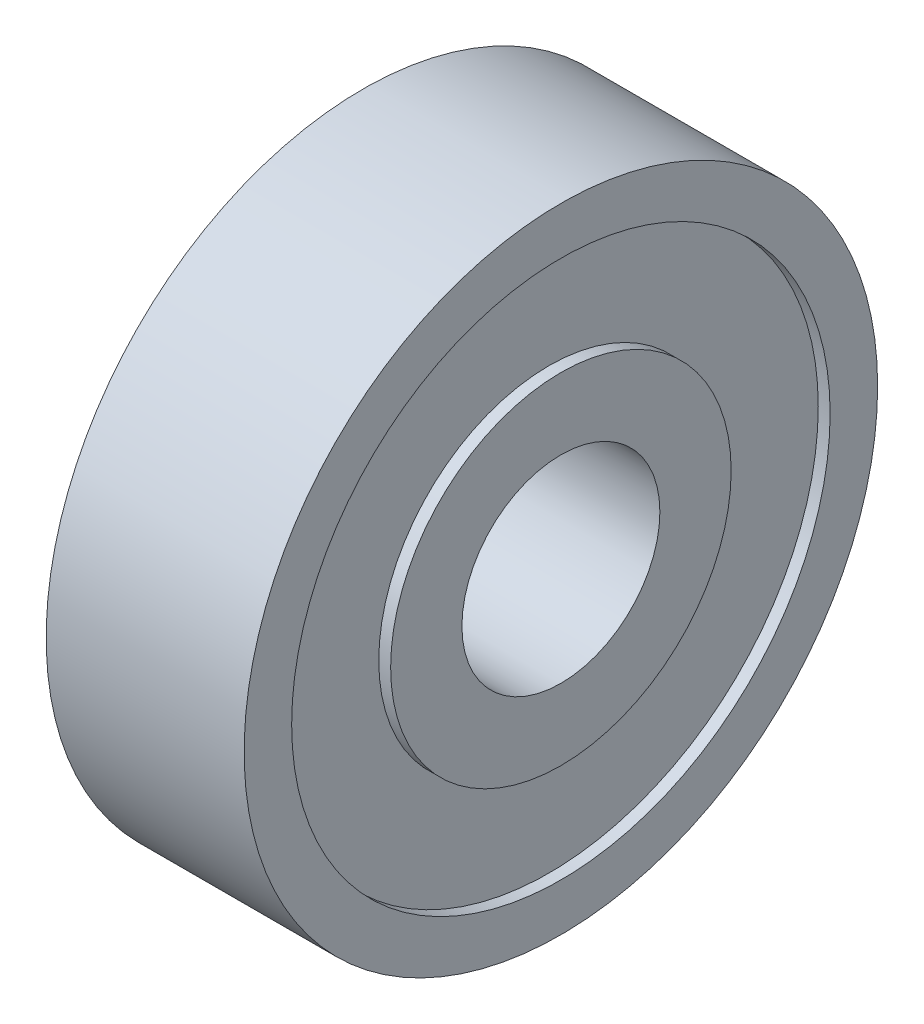
ISO-10303-21;
HEADER;
FILE_DESCRIPTION(('STEP AP214'),'2;1');
FILE_NAME('part.step','',(''),(''),'','','');
FILE_SCHEMA(('AUTOMOTIVE_DESIGN { 1 0 10303 214 1 1 1 1 }'));
ENDSEC;
DATA;
#1=APPLICATION_CONTEXT('core data for automotive mechanical design processes');
#2=APPLICATION_PROTOCOL_DEFINITION('international standard','automotive_design',2000,#1);
#3=PRODUCT_CONTEXT('',#1,'mechanical');
#4=PRODUCT('Part','Part','',(#3));
#5=PRODUCT_RELATED_PRODUCT_CATEGORY('part','',(#4));
#6=PRODUCT_DEFINITION_FORMATION('','',#4);
#7=PRODUCT_DEFINITION_CONTEXT('part definition',#1,'design');
#8=PRODUCT_DEFINITION('design','',#6,#7);
#9=PRODUCT_DEFINITION_SHAPE('','',#8);
#10=(LENGTH_UNIT() NAMED_UNIT(*) SI_UNIT(.MILLI.,.METRE.));
#11=(NAMED_UNIT(*) PLANE_ANGLE_UNIT() SI_UNIT($,.RADIAN.));
#12=(NAMED_UNIT(*) SI_UNIT($,.STERADIAN.) SOLID_ANGLE_UNIT());
#13=UNCERTAINTY_MEASURE_WITH_UNIT(LENGTH_MEASURE(1.E-05),#10,'distance_accuracy_value','');
#14=(GEOMETRIC_REPRESENTATION_CONTEXT(3) GLOBAL_UNCERTAINTY_ASSIGNED_CONTEXT((#13)) GLOBAL_UNIT_ASSIGNED_CONTEXT((#10,
#11,#12)) REPRESENTATION_CONTEXT('',''));
#15=CARTESIAN_POINT('',(0.,0.,0.));
#16=DIRECTION('',(0.,0.,1.));
#17=DIRECTION('',(1.,0.,0.));
#18=AXIS2_PLACEMENT_3D('',#15,#16,#17);
#19=CARTESIAN_POINT('',(-2.5,2.5,0.));
#20=DIRECTION('',(-1.,0.,0.));
#21=DIRECTION('',(0.,0.,1.));
#22=AXIS2_PLACEMENT_3D('',#19,#20,#21);
#23=PLANE('',#22);
#24=CARTESIAN_POINT('',(-2.5,0.,0.));
#25=DIRECTION('',(1.,0.,0.));
#26=DIRECTION('',(0.,0.,-1.));
#27=AXIS2_PLACEMENT_3D('',#24,#25,#26);
#28=CIRCLE('',#27,2.5);
#29=CARTESIAN_POINT('',(-2.5,0.,-2.5));
#30=VERTEX_POINT('',#29);
#31=EDGE_CURVE('E99',#30,#30,#28,.T.);
#32=ORIENTED_EDGE('',*,*,#31,.T.);
#33=EDGE_LOOP('',(#32));
#34=FACE_BOUND('',#33,.T.);
#35=CARTESIAN_POINT('',(-2.5,0.,0.));
#36=DIRECTION('',(1.,0.,0.));
#37=DIRECTION('',(0.,0.,-1.));
#38=AXIS2_PLACEMENT_3D('',#35,#36,#37);
#39=CIRCLE('',#38,4.3);
#40=CARTESIAN_POINT('',(-2.5,0.,-4.3));
#41=VERTEX_POINT('',#40);
#42=EDGE_CURVE('E10',#41,#41,#39,.T.);
#43=ORIENTED_EDGE('',*,*,#42,.F.);
#44=EDGE_LOOP('',(#43));
#45=FACE_BOUND('',#44,.T.);
#46=ADVANCED_FACE('F47',(#34,#45),#23,.T.);
#47=CARTESIAN_POINT('',(0.,0.,0.));
#48=DIRECTION('',(1.,0.,0.));
#49=DIRECTION('',(0.,0.,-1.));
#50=AXIS2_PLACEMENT_3D('',#47,#48,#49);
#51=CYLINDRICAL_SURFACE('',#50,4.3);
#52=ORIENTED_EDGE('',*,*,#42,.T.);
#53=EDGE_LOOP('',(#52));
#54=FACE_BOUND('',#53,.T.);
#55=CARTESIAN_POINT('',(-2.2,0.,0.));
#56=DIRECTION('',(1.,0.,0.));
#57=DIRECTION('',(0.,0.,-1.));
#58=AXIS2_PLACEMENT_3D('',#55,#56,#57);
#59=CIRCLE('',#58,4.3);
#60=CARTESIAN_POINT('',(-2.2,0.,-4.3));
#61=VERTEX_POINT('',#60);
#62=EDGE_CURVE('E54',#61,#61,#59,.T.);
#63=ORIENTED_EDGE('',*,*,#62,.F.);
#64=EDGE_LOOP('',(#63));
#65=FACE_BOUND('',#64,.T.);
#66=ADVANCED_FACE('F117',(#54,#65),#51,.T.);
#67=CARTESIAN_POINT('',(-2.2,4.3,0.));
#68=DIRECTION('',(-1.,0.,0.));
#69=DIRECTION('',(0.,0.,1.));
#70=AXIS2_PLACEMENT_3D('',#67,#68,#69);
#71=PLANE('',#70);
#72=ORIENTED_EDGE('',*,*,#62,.T.);
#73=EDGE_LOOP('',(#72));
#74=FACE_BOUND('',#73,.T.);
#75=CARTESIAN_POINT('',(-2.2,0.,0.));
#76=DIRECTION('',(1.,0.,0.));
#77=DIRECTION('',(0.,0.,-1.));
#78=AXIS2_PLACEMENT_3D('',#75,#76,#77);
#79=CIRCLE('',#78,6.8);
#80=CARTESIAN_POINT('',(-2.2,0.,-6.8));
#81=VERTEX_POINT('',#80);
#82=EDGE_CURVE('E60',#81,#81,#79,.T.);
#83=ORIENTED_EDGE('',*,*,#82,.F.);
#84=EDGE_LOOP('',(#83));
#85=FACE_BOUND('',#84,.T.);
#86=ADVANCED_FACE('F121',(#74,#85),#71,.T.);
#87=CARTESIAN_POINT('',(0.,0.,0.));
#88=DIRECTION('',(1.,0.,0.));
#89=DIRECTION('',(0.,0.,-1.));
#90=AXIS2_PLACEMENT_3D('',#87,#88,#89);
#91=CYLINDRICAL_SURFACE('',#90,6.8);
#92=ORIENTED_EDGE('',*,*,#82,.T.);
#93=EDGE_LOOP('',(#92));
#94=FACE_BOUND('',#93,.T.);
#95=CARTESIAN_POINT('',(-2.5,0.,0.));
#96=DIRECTION('',(1.,0.,0.));
#97=DIRECTION('',(0.,0.,-1.));
#98=AXIS2_PLACEMENT_3D('',#95,#96,#97);
#99=CIRCLE('',#98,6.8);
#100=CARTESIAN_POINT('',(-2.5,0.,-6.8));
#101=VERTEX_POINT('',#100);
#102=EDGE_CURVE('E66',#101,#101,#99,.T.);
#103=ORIENTED_EDGE('',*,*,#102,.F.);
#104=EDGE_LOOP('',(#103));
#105=FACE_BOUND('',#104,.T.);
#106=ADVANCED_FACE('F126',(#94,#105),#91,.F.);
#107=CARTESIAN_POINT('',(-2.5,6.8,0.));
#108=DIRECTION('',(-1.,0.,0.));
#109=DIRECTION('',(0.,0.,1.));
#110=AXIS2_PLACEMENT_3D('',#107,#108,#109);
#111=PLANE('',#110);
#112=ORIENTED_EDGE('',*,*,#102,.T.);
#113=EDGE_LOOP('',(#112));
#114=FACE_BOUND('',#113,.T.);
#115=CARTESIAN_POINT('',(-2.5,0.,0.));
#116=DIRECTION('',(1.,0.,0.));
#117=DIRECTION('',(0.,0.,-1.));
#118=AXIS2_PLACEMENT_3D('',#115,#116,#117);
#119=CIRCLE('',#118,8.);
#120=CARTESIAN_POINT('',(-2.5,0.,-8.));
#121=VERTEX_POINT('',#120);
#122=EDGE_CURVE('E71',#121,#121,#119,.T.);
#123=ORIENTED_EDGE('',*,*,#122,.F.);
#124=EDGE_LOOP('',(#123));
#125=FACE_BOUND('',#124,.T.);
#126=ADVANCED_FACE('F132',(#114,#125),#111,.T.);
#127=CARTESIAN_POINT('',(0.,0.,0.));
#128=DIRECTION('',(1.,0.,0.));
#129=DIRECTION('',(0.,0.,-1.));
#130=AXIS2_PLACEMENT_3D('',#127,#128,#129);
#131=CYLINDRICAL_SURFACE('',#130,8.);
#132=ORIENTED_EDGE('',*,*,#122,.T.);
#133=EDGE_LOOP('',(#132));
#134=FACE_BOUND('',#133,.T.);
#135=CARTESIAN_POINT('',(2.5,0.,0.));
#136=DIRECTION('',(1.,0.,0.));
#137=DIRECTION('',(0.,0.,-1.));
#138=AXIS2_PLACEMENT_3D('',#135,#136,#137);
#139=CIRCLE('',#138,8.);
#140=CARTESIAN_POINT('',(2.5,0.,-8.));
#141=VERTEX_POINT('',#140);
#142=EDGE_CURVE('E75',#141,#141,#139,.T.);
#143=ORIENTED_EDGE('',*,*,#142,.F.);
#144=EDGE_LOOP('',(#143));
#145=FACE_BOUND('',#144,.T.);
#146=ADVANCED_FACE('F135',(#134,#145),#131,.T.);
#147=CARTESIAN_POINT('',(2.5,6.8,0.));
#148=DIRECTION('',(1.,0.,0.));
#149=DIRECTION('',(0.,0.,-1.));
#150=AXIS2_PLACEMENT_3D('',#147,#148,#149);
#151=PLANE('',#150);
#152=ORIENTED_EDGE('',*,*,#142,.T.);
#153=EDGE_LOOP('',(#152));
#154=FACE_BOUND('',#153,.T.);
#155=CARTESIAN_POINT('',(2.5,0.,0.));
#156=DIRECTION('',(1.,0.,0.));
#157=DIRECTION('',(0.,0.,-1.));
#158=AXIS2_PLACEMENT_3D('',#155,#156,#157);
#159=CIRCLE('',#158,6.8);
#160=CARTESIAN_POINT('',(2.5,0.,-6.8));
#161=VERTEX_POINT('',#160);
#162=EDGE_CURVE('E79',#161,#161,#159,.T.);
#163=ORIENTED_EDGE('',*,*,#162,.F.);
#164=EDGE_LOOP('',(#163));
#165=FACE_BOUND('',#164,.T.);
#166=ADVANCED_FACE('F139',(#154,#165),#151,.T.);
#167=CARTESIAN_POINT('',(0.,0.,0.));
#168=DIRECTION('',(1.,0.,0.));
#169=DIRECTION('',(0.,0.,-1.));
#170=AXIS2_PLACEMENT_3D('',#167,#168,#169);
#171=CYLINDRICAL_SURFACE('',#170,6.8);
#172=ORIENTED_EDGE('',*,*,#162,.T.);
#173=EDGE_LOOP('',(#172));
#174=FACE_BOUND('',#173,.T.);
#175=CARTESIAN_POINT('',(2.2,0.,0.));
#176=DIRECTION('',(1.,0.,0.));
#177=DIRECTION('',(0.,0.,-1.));
#178=AXIS2_PLACEMENT_3D('',#175,#176,#177);
#179=CIRCLE('',#178,6.8);
#180=CARTESIAN_POINT('',(2.2,0.,-6.8));
#181=VERTEX_POINT('',#180);
#182=EDGE_CURVE('E83',#181,#181,#179,.T.);
#183=ORIENTED_EDGE('',*,*,#182,.F.);
#184=EDGE_LOOP('',(#183));
#185=FACE_BOUND('',#184,.T.);
#186=ADVANCED_FACE('F143',(#174,#185),#171,.F.);
#187=CARTESIAN_POINT('',(2.2,4.3,0.));
#188=DIRECTION('',(1.,0.,0.));
#189=DIRECTION('',(0.,0.,-1.));
#190=AXIS2_PLACEMENT_3D('',#187,#188,#189);
#191=PLANE('',#190);
#192=ORIENTED_EDGE('',*,*,#182,.T.);
#193=EDGE_LOOP('',(#192));
#194=FACE_BOUND('',#193,.T.);
#195=CARTESIAN_POINT('',(2.2,0.,0.));
#196=DIRECTION('',(1.,0.,0.));
#197=DIRECTION('',(0.,0.,-1.));
#198=AXIS2_PLACEMENT_3D('',#195,#196,#197);
#199=CIRCLE('',#198,4.3);
#200=CARTESIAN_POINT('',(2.2,0.,-4.3));
#201=VERTEX_POINT('',#200);
#202=EDGE_CURVE('E87',#201,#201,#199,.T.);
#203=ORIENTED_EDGE('',*,*,#202,.F.);
#204=EDGE_LOOP('',(#203));
#205=FACE_BOUND('',#204,.T.);
#206=ADVANCED_FACE('F146',(#194,#205),#191,.T.);
#207=CARTESIAN_POINT('',(0.,0.,0.));
#208=DIRECTION('',(1.,0.,0.));
#209=DIRECTION('',(0.,0.,-1.));
#210=AXIS2_PLACEMENT_3D('',#207,#208,#209);
#211=CYLINDRICAL_SURFACE('',#210,4.3);
#212=ORIENTED_EDGE('',*,*,#202,.T.);
#213=EDGE_LOOP('',(#212));
#214=FACE_BOUND('',#213,.T.);
#215=CARTESIAN_POINT('',(2.5,0.,0.));
#216=DIRECTION('',(1.,0.,0.));
#217=DIRECTION('',(0.,0.,-1.));
#218=AXIS2_PLACEMENT_3D('',#215,#216,#217);
#219=CIRCLE('',#218,4.3);
#220=CARTESIAN_POINT('',(2.5,0.,-4.3));
#221=VERTEX_POINT('',#220);
#222=EDGE_CURVE('E91',#221,#221,#219,.T.);
#223=ORIENTED_EDGE('',*,*,#222,.F.);
#224=EDGE_LOOP('',(#223));
#225=FACE_BOUND('',#224,.T.);
#226=ADVANCED_FACE('F114',(#214,#225),#211,.T.);
#227=CARTESIAN_POINT('',(2.5,2.5,0.));
#228=DIRECTION('',(1.,0.,0.));
#229=DIRECTION('',(0.,0.,-1.));
#230=AXIS2_PLACEMENT_3D('',#227,#228,#229);
#231=PLANE('',#230);
#232=ORIENTED_EDGE('',*,*,#222,.T.);
#233=EDGE_LOOP('',(#232));
#234=FACE_BOUND('',#233,.T.);
#235=CARTESIAN_POINT('',(2.5,0.,0.));
#236=DIRECTION('',(1.,0.,0.));
#237=DIRECTION('',(0.,0.,-1.));
#238=AXIS2_PLACEMENT_3D('',#235,#236,#237);
#239=CIRCLE('',#238,2.5);
#240=CARTESIAN_POINT('',(2.5,0.,-2.5));
#241=VERTEX_POINT('',#240);
#242=EDGE_CURVE('E95',#241,#241,#239,.T.);
#243=ORIENTED_EDGE('',*,*,#242,.F.);
#244=EDGE_LOOP('',(#243));
#245=FACE_BOUND('',#244,.T.);
#246=ADVANCED_FACE('F107',(#234,#245),#231,.T.);
#247=CARTESIAN_POINT('',(0.,0.,0.));
#248=DIRECTION('',(1.,0.,0.));
#249=DIRECTION('',(0.,0.,-1.));
#250=AXIS2_PLACEMENT_3D('',#247,#248,#249);
#251=CYLINDRICAL_SURFACE('',#250,2.5);
#252=ORIENTED_EDGE('',*,*,#242,.T.);
#253=EDGE_LOOP('',(#252));
#254=FACE_BOUND('',#253,.T.);
#255=ORIENTED_EDGE('',*,*,#31,.F.);
#256=EDGE_LOOP('',(#255));
#257=FACE_BOUND('',#256,.T.);
#258=ADVANCED_FACE('F105',(#254,#257),#251,.F.);
#259=CLOSED_SHELL('',(#46,#66,#86,#106,#126,#146,#166,#186,#206,#226,#246,#258));
#260=MANIFOLD_SOLID_BREP('B2',#259);
#261=ADVANCED_BREP_SHAPE_REPRESENTATION('',(#18,#260),#14);
#262=SHAPE_DEFINITION_REPRESENTATION(#9,#261);
ENDSEC;
END-ISO-10303-21;
